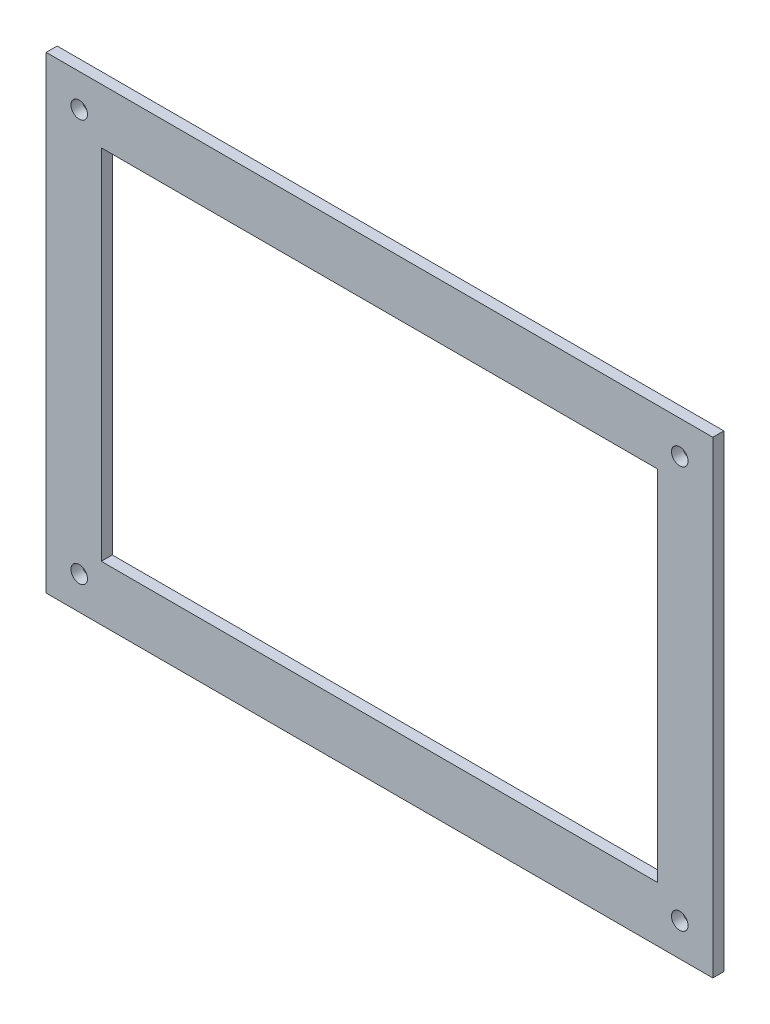
ISO-10303-21;
HEADER;
FILE_DESCRIPTION(('STEP AP214'),'2;1');
FILE_NAME('part.step','',(''),(''),'','','');
FILE_SCHEMA(('AUTOMOTIVE_DESIGN { 1 0 10303 214 1 1 1 1 }'));
ENDSEC;
DATA;
#1=APPLICATION_CONTEXT('core data for automotive mechanical design processes');
#2=APPLICATION_PROTOCOL_DEFINITION('international standard','automotive_design',2000,#1);
#3=PRODUCT_CONTEXT('',#1,'mechanical');
#4=PRODUCT('Part','Part','',(#3));
#5=PRODUCT_RELATED_PRODUCT_CATEGORY('part','',(#4));
#6=PRODUCT_DEFINITION_FORMATION('','',#4);
#7=PRODUCT_DEFINITION_CONTEXT('part definition',#1,'design');
#8=PRODUCT_DEFINITION('design','',#6,#7);
#9=PRODUCT_DEFINITION_SHAPE('','',#8);
#10=(LENGTH_UNIT() NAMED_UNIT(*) SI_UNIT(.MILLI.,.METRE.));
#11=(NAMED_UNIT(*) PLANE_ANGLE_UNIT() SI_UNIT($,.RADIAN.));
#12=(NAMED_UNIT(*) SI_UNIT($,.STERADIAN.) SOLID_ANGLE_UNIT());
#13=UNCERTAINTY_MEASURE_WITH_UNIT(LENGTH_MEASURE(1.E-05),#10,'distance_accuracy_value','');
#14=(GEOMETRIC_REPRESENTATION_CONTEXT(3) GLOBAL_UNCERTAINTY_ASSIGNED_CONTEXT((#13)) GLOBAL_UNIT_ASSIGNED_CONTEXT((#10,
#11,#12)) REPRESENTATION_CONTEXT('',''));
#15=CARTESIAN_POINT('',(0.,0.,0.));
#16=DIRECTION('',(0.,0.,1.));
#17=DIRECTION('',(1.,0.,0.));
#18=AXIS2_PLACEMENT_3D('',#15,#16,#17);
#19=CARTESIAN_POINT('',(0.,0.,2.));
#20=DIRECTION('',(1.,0.,0.));
#21=DIRECTION('',(0.,0.,-1.));
#22=AXIS2_PLACEMENT_3D('',#19,#20,#21);
#23=PLANE('',#22);
#24=DIRECTION('',(0.,-1.,0.));
#25=VECTOR('',#24,1.);
#26=CARTESIAN_POINT('',(0.,0.,0.));
#27=LINE('',#26,#25);
#28=CARTESIAN_POINT('',(0.,85.,0.));
#29=VERTEX_POINT('',#28);
#30=CARTESIAN_POINT('',(0.,0.,0.));
#31=VERTEX_POINT('',#30);
#32=EDGE_CURVE('E151',#29,#31,#27,.T.);
#33=ORIENTED_EDGE('',*,*,#32,.T.);
#34=DIRECTION('',(0.,0.,-1.));
#35=VECTOR('',#34,1.);
#36=CARTESIAN_POINT('',(0.,0.,2.));
#37=LINE('',#36,#35);
#38=CARTESIAN_POINT('',(0.,0.,2.));
#39=VERTEX_POINT('',#38);
#40=EDGE_CURVE('E11',#39,#31,#37,.T.);
#41=ORIENTED_EDGE('',*,*,#40,.F.);
#42=DIRECTION('',(0.,-1.,0.));
#43=VECTOR('',#42,1.);
#44=CARTESIAN_POINT('',(0.,0.,2.));
#45=LINE('',#44,#43);
#46=CARTESIAN_POINT('',(0.,85.,2.));
#47=VERTEX_POINT('',#46);
#48=EDGE_CURVE('E157',#47,#39,#45,.T.);
#49=ORIENTED_EDGE('',*,*,#48,.F.);
#50=DIRECTION('',(0.,0.,-1.));
#51=VECTOR('',#50,1.);
#52=CARTESIAN_POINT('',(0.,85.,2.));
#53=LINE('',#52,#51);
#54=EDGE_CURVE('E171',#47,#29,#53,.T.);
#55=ORIENTED_EDGE('',*,*,#54,.T.);
#56=EDGE_LOOP('',(#33,#41,#49,#55));
#57=FACE_BOUND('',#56,.T.);
#58=ADVANCED_FACE('F39',(#57),#23,.F.);
#59=CARTESIAN_POINT('',(0.,0.,2.));
#60=DIRECTION('',(0.,1.,0.));
#61=DIRECTION('',(0.,0.,1.));
#62=AXIS2_PLACEMENT_3D('',#59,#60,#61);
#63=PLANE('',#62);
#64=DIRECTION('',(1.,0.,0.));
#65=VECTOR('',#64,1.);
#66=CARTESIAN_POINT('',(0.,0.,0.));
#67=LINE('',#66,#65);
#68=CARTESIAN_POINT('',(121.,0.,0.));
#69=VERTEX_POINT('',#68);
#70=EDGE_CURVE('E175',#31,#69,#67,.T.);
#71=ORIENTED_EDGE('',*,*,#70,.T.);
#72=DIRECTION('',(0.,0.,-1.));
#73=VECTOR('',#72,1.);
#74=CARTESIAN_POINT('',(121.,0.,2.));
#75=LINE('',#74,#73);
#76=CARTESIAN_POINT('',(121.,0.,2.));
#77=VERTEX_POINT('',#76);
#78=EDGE_CURVE('E47',#77,#69,#75,.T.);
#79=ORIENTED_EDGE('',*,*,#78,.F.);
#80=DIRECTION('',(1.,0.,0.));
#81=VECTOR('',#80,1.);
#82=CARTESIAN_POINT('',(0.,0.,2.));
#83=LINE('',#82,#81);
#84=EDGE_CURVE('E161',#39,#77,#83,.T.);
#85=ORIENTED_EDGE('',*,*,#84,.F.);
#86=ORIENTED_EDGE('',*,*,#40,.T.);
#87=EDGE_LOOP('',(#71,#79,#85,#86));
#88=FACE_BOUND('',#87,.T.);
#89=ADVANCED_FACE('F209',(#88),#63,.F.);
#90=CARTESIAN_POINT('',(121.,0.,2.));
#91=DIRECTION('',(-1.,0.,0.));
#92=DIRECTION('',(0.,0.,1.));
#93=AXIS2_PLACEMENT_3D('',#90,#91,#92);
#94=PLANE('',#93);
#95=DIRECTION('',(0.,1.,0.));
#96=VECTOR('',#95,1.);
#97=CARTESIAN_POINT('',(121.,0.,0.));
#98=LINE('',#97,#96);
#99=CARTESIAN_POINT('',(121.,85.,0.));
#100=VERTEX_POINT('',#99);
#101=EDGE_CURVE('E178',#69,#100,#98,.T.);
#102=ORIENTED_EDGE('',*,*,#101,.T.);
#103=DIRECTION('',(0.,0.,-1.));
#104=VECTOR('',#103,1.);
#105=CARTESIAN_POINT('',(121.,85.,2.));
#106=LINE('',#105,#104);
#107=CARTESIAN_POINT('',(121.,85.,2.));
#108=VERTEX_POINT('',#107);
#109=EDGE_CURVE('E186',#108,#100,#106,.T.);
#110=ORIENTED_EDGE('',*,*,#109,.F.);
#111=DIRECTION('',(0.,1.,0.));
#112=VECTOR('',#111,1.);
#113=CARTESIAN_POINT('',(121.,0.,2.));
#114=LINE('',#113,#112);
#115=EDGE_CURVE('E165',#77,#108,#114,.T.);
#116=ORIENTED_EDGE('',*,*,#115,.F.);
#117=ORIENTED_EDGE('',*,*,#78,.T.);
#118=EDGE_LOOP('',(#102,#110,#116,#117));
#119=FACE_BOUND('',#118,.T.);
#120=ADVANCED_FACE('F195',(#119),#94,.F.);
#121=CARTESIAN_POINT('',(0.,85.,2.));
#122=DIRECTION('',(0.,-1.,0.));
#123=DIRECTION('',(0.,0.,-1.));
#124=AXIS2_PLACEMENT_3D('',#121,#122,#123);
#125=PLANE('',#124);
#126=DIRECTION('',(-1.,0.,0.));
#127=VECTOR('',#126,1.);
#128=CARTESIAN_POINT('',(0.,85.,0.));
#129=LINE('',#128,#127);
#130=EDGE_CURVE('E162',#100,#29,#129,.T.);
#131=ORIENTED_EDGE('',*,*,#130,.T.);
#132=ORIENTED_EDGE('',*,*,#54,.F.);
#133=DIRECTION('',(-1.,0.,0.));
#134=VECTOR('',#133,1.);
#135=CARTESIAN_POINT('',(0.,85.,2.));
#136=LINE('',#135,#134);
#137=EDGE_CURVE('E168',#108,#47,#136,.T.);
#138=ORIENTED_EDGE('',*,*,#137,.F.);
#139=ORIENTED_EDGE('',*,*,#109,.T.);
#140=EDGE_LOOP('',(#131,#132,#138,#139));
#141=FACE_BOUND('',#140,.T.);
#142=ADVANCED_FACE('F202',(#141),#125,.F.);
#143=CARTESIAN_POINT('',(0.,0.,2.));
#144=DIRECTION('',(0.,0.,-1.));
#145=DIRECTION('',(-1.,0.,0.));
#146=AXIS2_PLACEMENT_3D('',#143,#144,#145);
#147=PLANE('',#146);
#148=CARTESIAN_POINT('',(115.,79.,2.));
#149=DIRECTION('',(0.,0.,1.));
#150=DIRECTION('',(1.,0.,0.));
#151=AXIS2_PLACEMENT_3D('',#148,#149,#150);
#152=CIRCLE('',#151,1.5);
#153=CARTESIAN_POINT('',(116.5,79.,2.));
#154=VERTEX_POINT('',#153);
#155=EDGE_CURVE('E271',#154,#154,#152,.T.);
#156=ORIENTED_EDGE('',*,*,#155,.F.);
#157=EDGE_LOOP('',(#156));
#158=FACE_BOUND('',#157,.T.);
#159=CARTESIAN_POINT('',(6.,6.,2.));
#160=DIRECTION('',(0.,0.,1.));
#161=DIRECTION('',(1.,0.,0.));
#162=AXIS2_PLACEMENT_3D('',#159,#160,#161);
#163=CIRCLE('',#162,1.5);
#164=CARTESIAN_POINT('',(7.5,6.,2.));
#165=VERTEX_POINT('',#164);
#166=EDGE_CURVE('E264',#165,#165,#163,.T.);
#167=ORIENTED_EDGE('',*,*,#166,.F.);
#168=EDGE_LOOP('',(#167));
#169=FACE_BOUND('',#168,.T.);
#170=CARTESIAN_POINT('',(115.,6.,2.));
#171=DIRECTION('',(0.,0.,1.));
#172=DIRECTION('',(1.,0.,0.));
#173=AXIS2_PLACEMENT_3D('',#170,#171,#172);
#174=CIRCLE('',#173,1.5);
#175=CARTESIAN_POINT('',(116.5,6.,2.));
#176=VERTEX_POINT('',#175);
#177=EDGE_CURVE('E259',#176,#176,#174,.T.);
#178=ORIENTED_EDGE('',*,*,#177,.F.);
#179=EDGE_LOOP('',(#178));
#180=FACE_BOUND('',#179,.T.);
#181=CARTESIAN_POINT('',(6.,79.,2.));
#182=DIRECTION('',(0.,0.,1.));
#183=DIRECTION('',(1.,0.,0.));
#184=AXIS2_PLACEMENT_3D('',#181,#182,#183);
#185=CIRCLE('',#184,1.5);
#186=CARTESIAN_POINT('',(7.5,79.,2.));
#187=VERTEX_POINT('',#186);
#188=EDGE_CURVE('E132',#187,#187,#185,.T.);
#189=ORIENTED_EDGE('',*,*,#188,.F.);
#190=EDGE_LOOP('',(#189));
#191=FACE_BOUND('',#190,.T.);
#192=DIRECTION('',(1.,0.,0.));
#193=VECTOR('',#192,1.);
#194=CARTESIAN_POINT('',(10.,10.,2.));
#195=LINE('',#194,#193);
#196=CARTESIAN_POINT('',(10.,10.,2.));
#197=VERTEX_POINT('',#196);
#198=CARTESIAN_POINT('',(111.,10.,2.));
#199=VERTEX_POINT('',#198);
#200=EDGE_CURVE('E141',#197,#199,#195,.T.);
#201=ORIENTED_EDGE('',*,*,#200,.F.);
#202=DIRECTION('',(0.,-1.,0.));
#203=VECTOR('',#202,1.);
#204=CARTESIAN_POINT('',(10.,10.,2.));
#205=LINE('',#204,#203);
#206=CARTESIAN_POINT('',(10.,75.,2.));
#207=VERTEX_POINT('',#206);
#208=EDGE_CURVE('E54',#207,#197,#205,.T.);
#209=ORIENTED_EDGE('',*,*,#208,.F.);
#210=DIRECTION('',(-1.,0.,0.));
#211=VECTOR('',#210,1.);
#212=CARTESIAN_POINT('',(10.,75.,2.));
#213=LINE('',#212,#211);
#214=CARTESIAN_POINT('',(111.,75.,2.));
#215=VERTEX_POINT('',#214);
#216=EDGE_CURVE('E125',#215,#207,#213,.T.);
#217=ORIENTED_EDGE('',*,*,#216,.F.);
#218=DIRECTION('',(0.,1.,0.));
#219=VECTOR('',#218,1.);
#220=CARTESIAN_POINT('',(111.,10.,2.));
#221=LINE('',#220,#219);
#222=EDGE_CURVE('E129',#199,#215,#221,.T.);
#223=ORIENTED_EDGE('',*,*,#222,.F.);
#224=EDGE_LOOP('',(#201,#209,#217,#223));
#225=FACE_BOUND('',#224,.T.);
#226=ORIENTED_EDGE('',*,*,#48,.T.);
#227=ORIENTED_EDGE('',*,*,#84,.T.);
#228=ORIENTED_EDGE('',*,*,#115,.T.);
#229=ORIENTED_EDGE('',*,*,#137,.T.);
#230=EDGE_LOOP('',(#226,#227,#228,#229));
#231=FACE_BOUND('',#230,.T.);
#232=ADVANCED_FACE('F208',(#158,#169,#180,#191,#225,#231),#147,.F.);
#233=CARTESIAN_POINT('',(0.,0.,0.));
#234=DIRECTION('',(0.,0.,-1.));
#235=DIRECTION('',(-1.,0.,0.));
#236=AXIS2_PLACEMENT_3D('',#233,#234,#235);
#237=PLANE('',#236);
#238=CARTESIAN_POINT('',(115.,79.,0.));
#239=DIRECTION('',(0.,0.,1.));
#240=DIRECTION('',(1.,0.,0.));
#241=AXIS2_PLACEMENT_3D('',#238,#239,#240);
#242=CIRCLE('',#241,1.5);
#243=CARTESIAN_POINT('',(116.5,79.,0.));
#244=VERTEX_POINT('',#243);
#245=EDGE_CURVE('E267',#244,#244,#242,.T.);
#246=ORIENTED_EDGE('',*,*,#245,.T.);
#247=EDGE_LOOP('',(#246));
#248=FACE_BOUND('',#247,.T.);
#249=CARTESIAN_POINT('',(6.,6.,0.));
#250=DIRECTION('',(0.,0.,1.));
#251=DIRECTION('',(1.,0.,0.));
#252=AXIS2_PLACEMENT_3D('',#249,#250,#251);
#253=CIRCLE('',#252,1.5);
#254=CARTESIAN_POINT('',(7.5,6.,0.));
#255=VERTEX_POINT('',#254);
#256=EDGE_CURVE('E275',#255,#255,#253,.T.);
#257=ORIENTED_EDGE('',*,*,#256,.T.);
#258=EDGE_LOOP('',(#257));
#259=FACE_BOUND('',#258,.T.);
#260=CARTESIAN_POINT('',(115.,6.,0.));
#261=DIRECTION('',(0.,0.,1.));
#262=DIRECTION('',(1.,0.,0.));
#263=AXIS2_PLACEMENT_3D('',#260,#261,#262);
#264=CIRCLE('',#263,1.5);
#265=CARTESIAN_POINT('',(116.5,6.,0.));
#266=VERTEX_POINT('',#265);
#267=EDGE_CURVE('E256',#266,#266,#264,.T.);
#268=ORIENTED_EDGE('',*,*,#267,.T.);
#269=EDGE_LOOP('',(#268));
#270=FACE_BOUND('',#269,.T.);
#271=CARTESIAN_POINT('',(6.,79.,0.));
#272=DIRECTION('',(0.,0.,1.));
#273=DIRECTION('',(1.,0.,0.));
#274=AXIS2_PLACEMENT_3D('',#271,#272,#273);
#275=CIRCLE('',#274,1.5);
#276=CARTESIAN_POINT('',(7.5,79.,0.));
#277=VERTEX_POINT('',#276);
#278=EDGE_CURVE('E142',#277,#277,#275,.T.);
#279=ORIENTED_EDGE('',*,*,#278,.T.);
#280=EDGE_LOOP('',(#279));
#281=FACE_BOUND('',#280,.T.);
#282=DIRECTION('',(0.,-1.,0.));
#283=VECTOR('',#282,1.);
#284=CARTESIAN_POINT('',(10.,10.,0.));
#285=LINE('',#284,#283);
#286=CARTESIAN_POINT('',(10.,75.,0.));
#287=VERTEX_POINT('',#286);
#288=CARTESIAN_POINT('',(10.,10.,0.));
#289=VERTEX_POINT('',#288);
#290=EDGE_CURVE('E106',#287,#289,#285,.T.);
#291=ORIENTED_EDGE('',*,*,#290,.T.);
#292=DIRECTION('',(1.,0.,0.));
#293=VECTOR('',#292,1.);
#294=CARTESIAN_POINT('',(10.,10.,0.));
#295=LINE('',#294,#293);
#296=CARTESIAN_POINT('',(111.,10.,0.));
#297=VERTEX_POINT('',#296);
#298=EDGE_CURVE('E116',#289,#297,#295,.T.);
#299=ORIENTED_EDGE('',*,*,#298,.T.);
#300=DIRECTION('',(0.,1.,0.));
#301=VECTOR('',#300,1.);
#302=CARTESIAN_POINT('',(111.,10.,0.));
#303=LINE('',#302,#301);
#304=CARTESIAN_POINT('',(111.,75.,0.));
#305=VERTEX_POINT('',#304);
#306=EDGE_CURVE('E62',#297,#305,#303,.T.);
#307=ORIENTED_EDGE('',*,*,#306,.T.);
#308=DIRECTION('',(-1.,0.,0.));
#309=VECTOR('',#308,1.);
#310=CARTESIAN_POINT('',(10.,75.,0.));
#311=LINE('',#310,#309);
#312=EDGE_CURVE('E113',#305,#287,#311,.T.);
#313=ORIENTED_EDGE('',*,*,#312,.T.);
#314=EDGE_LOOP('',(#291,#299,#307,#313));
#315=FACE_BOUND('',#314,.T.);
#316=ORIENTED_EDGE('',*,*,#32,.F.);
#317=ORIENTED_EDGE('',*,*,#130,.F.);
#318=ORIENTED_EDGE('',*,*,#101,.F.);
#319=ORIENTED_EDGE('',*,*,#70,.F.);
#320=EDGE_LOOP('',(#316,#317,#318,#319));
#321=FACE_BOUND('',#320,.T.);
#322=ADVANCED_FACE('F121',(#248,#259,#270,#281,#315,#321),#237,.T.);
#323=CARTESIAN_POINT('',(10.,10.,0.));
#324=DIRECTION('',(-1.,0.,0.));
#325=DIRECTION('',(0.,0.,1.));
#326=AXIS2_PLACEMENT_3D('',#323,#324,#325);
#327=PLANE('',#326);
#328=ORIENTED_EDGE('',*,*,#208,.T.);
#329=DIRECTION('',(0.,0.,1.));
#330=VECTOR('',#329,1.);
#331=CARTESIAN_POINT('',(10.,10.,0.));
#332=LINE('',#331,#330);
#333=EDGE_CURVE('E102',#289,#197,#332,.T.);
#334=ORIENTED_EDGE('',*,*,#333,.F.);
#335=ORIENTED_EDGE('',*,*,#290,.F.);
#336=DIRECTION('',(0.,0.,1.));
#337=VECTOR('',#336,1.);
#338=CARTESIAN_POINT('',(10.,75.,0.));
#339=LINE('',#338,#337);
#340=EDGE_CURVE('E148',#287,#207,#339,.T.);
#341=ORIENTED_EDGE('',*,*,#340,.T.);
#342=EDGE_LOOP('',(#328,#334,#335,#341));
#343=FACE_BOUND('',#342,.T.);
#344=ADVANCED_FACE('F104',(#343),#327,.F.);
#345=CARTESIAN_POINT('',(10.,75.,0.));
#346=DIRECTION('',(0.,1.,0.));
#347=DIRECTION('',(0.,0.,1.));
#348=AXIS2_PLACEMENT_3D('',#345,#346,#347);
#349=PLANE('',#348);
#350=ORIENTED_EDGE('',*,*,#216,.T.);
#351=ORIENTED_EDGE('',*,*,#340,.F.);
#352=ORIENTED_EDGE('',*,*,#312,.F.);
#353=DIRECTION('',(0.,0.,1.));
#354=VECTOR('',#353,1.);
#355=CARTESIAN_POINT('',(111.,75.,0.));
#356=LINE('',#355,#354);
#357=EDGE_CURVE('E152',#305,#215,#356,.T.);
#358=ORIENTED_EDGE('',*,*,#357,.T.);
#359=EDGE_LOOP('',(#350,#351,#352,#358));
#360=FACE_BOUND('',#359,.T.);
#361=ADVANCED_FACE('F227',(#360),#349,.F.);
#362=CARTESIAN_POINT('',(111.,10.,0.));
#363=DIRECTION('',(1.,0.,0.));
#364=DIRECTION('',(0.,0.,-1.));
#365=AXIS2_PLACEMENT_3D('',#362,#363,#364);
#366=PLANE('',#365);
#367=ORIENTED_EDGE('',*,*,#222,.T.);
#368=ORIENTED_EDGE('',*,*,#357,.F.);
#369=ORIENTED_EDGE('',*,*,#306,.F.);
#370=DIRECTION('',(0.,0.,1.));
#371=VECTOR('',#370,1.);
#372=CARTESIAN_POINT('',(111.,10.,0.));
#373=LINE('',#372,#371);
#374=EDGE_CURVE('E112',#297,#199,#373,.T.);
#375=ORIENTED_EDGE('',*,*,#374,.T.);
#376=EDGE_LOOP('',(#367,#368,#369,#375));
#377=FACE_BOUND('',#376,.T.);
#378=ADVANCED_FACE('F231',(#377),#366,.F.);
#379=CARTESIAN_POINT('',(10.,10.,0.));
#380=DIRECTION('',(0.,-1.,0.));
#381=DIRECTION('',(0.,0.,-1.));
#382=AXIS2_PLACEMENT_3D('',#379,#380,#381);
#383=PLANE('',#382);
#384=ORIENTED_EDGE('',*,*,#200,.T.);
#385=ORIENTED_EDGE('',*,*,#374,.F.);
#386=ORIENTED_EDGE('',*,*,#298,.F.);
#387=ORIENTED_EDGE('',*,*,#333,.T.);
#388=EDGE_LOOP('',(#384,#385,#386,#387));
#389=FACE_BOUND('',#388,.T.);
#390=ADVANCED_FACE('F117',(#389),#383,.F.);
#391=CARTESIAN_POINT('',(6.,79.,0.));
#392=DIRECTION('',(0.,0.,1.));
#393=DIRECTION('',(1.,0.,0.));
#394=AXIS2_PLACEMENT_3D('',#391,#392,#393);
#395=CYLINDRICAL_SURFACE('',#394,1.5);
#396=ORIENTED_EDGE('',*,*,#278,.F.);
#397=EDGE_LOOP('',(#396));
#398=FACE_BOUND('',#397,.T.);
#399=ORIENTED_EDGE('',*,*,#188,.T.);
#400=EDGE_LOOP('',(#399));
#401=FACE_BOUND('',#400,.T.);
#402=ADVANCED_FACE('F230',(#398,#401),#395,.F.);
#403=CARTESIAN_POINT('',(115.,6.,0.));
#404=DIRECTION('',(0.,0.,1.));
#405=DIRECTION('',(1.,0.,0.));
#406=AXIS2_PLACEMENT_3D('',#403,#404,#405);
#407=CYLINDRICAL_SURFACE('',#406,1.5);
#408=ORIENTED_EDGE('',*,*,#267,.F.);
#409=EDGE_LOOP('',(#408));
#410=FACE_BOUND('',#409,.T.);
#411=ORIENTED_EDGE('',*,*,#177,.T.);
#412=EDGE_LOOP('',(#411));
#413=FACE_BOUND('',#412,.T.);
#414=ADVANCED_FACE('F239',(#410,#413),#407,.F.);
#415=CARTESIAN_POINT('',(6.,6.,0.));
#416=DIRECTION('',(0.,0.,1.));
#417=DIRECTION('',(1.,0.,0.));
#418=AXIS2_PLACEMENT_3D('',#415,#416,#417);
#419=CYLINDRICAL_SURFACE('',#418,1.5);
#420=ORIENTED_EDGE('',*,*,#256,.F.);
#421=EDGE_LOOP('',(#420));
#422=FACE_BOUND('',#421,.T.);
#423=ORIENTED_EDGE('',*,*,#166,.T.);
#424=EDGE_LOOP('',(#423));
#425=FACE_BOUND('',#424,.T.);
#426=ADVANCED_FACE('F241',(#422,#425),#419,.F.);
#427=CARTESIAN_POINT('',(115.,79.,0.));
#428=DIRECTION('',(0.,0.,1.));
#429=DIRECTION('',(1.,0.,0.));
#430=AXIS2_PLACEMENT_3D('',#427,#428,#429);
#431=CYLINDRICAL_SURFACE('',#430,1.5);
#432=ORIENTED_EDGE('',*,*,#245,.F.);
#433=EDGE_LOOP('',(#432));
#434=FACE_BOUND('',#433,.T.);
#435=ORIENTED_EDGE('',*,*,#155,.T.);
#436=EDGE_LOOP('',(#435));
#437=FACE_BOUND('',#436,.T.);
#438=ADVANCED_FACE('F244',(#434,#437),#431,.F.);
#439=CLOSED_SHELL('',(#58,#89,#120,#142,#232,#322,#344,#361,#378,#390,#402,#414,#426,#438));
#440=MANIFOLD_SOLID_BREP('B2',#439);
#441=ADVANCED_BREP_SHAPE_REPRESENTATION('',(#18,#440),#14);
#442=SHAPE_DEFINITION_REPRESENTATION(#9,#441);
ENDSEC;
END-ISO-10303-21;
